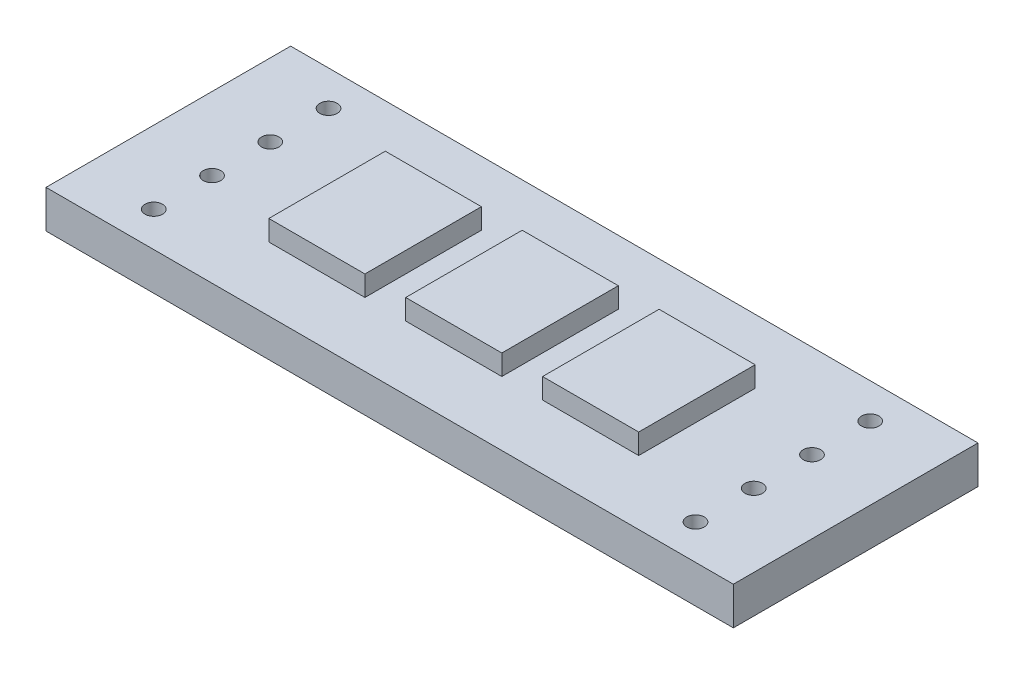
ISO-10303-21;
HEADER;
FILE_DESCRIPTION(('STEP AP214'),'2;1');
FILE_NAME('part.step','',(''),(''),'','','');
FILE_SCHEMA(('AUTOMOTIVE_DESIGN { 1 0 10303 214 1 1 1 1 }'));
ENDSEC;
DATA;
#1=APPLICATION_CONTEXT('core data for automotive mechanical design processes');
#2=APPLICATION_PROTOCOL_DEFINITION('international standard','automotive_design',2000,#1);
#3=PRODUCT_CONTEXT('',#1,'mechanical');
#4=PRODUCT('Part','Part','',(#3));
#5=PRODUCT_RELATED_PRODUCT_CATEGORY('part','',(#4));
#6=PRODUCT_DEFINITION_FORMATION('','',#4);
#7=PRODUCT_DEFINITION_CONTEXT('part definition',#1,'design');
#8=PRODUCT_DEFINITION('design','',#6,#7);
#9=PRODUCT_DEFINITION_SHAPE('','',#8);
#10=(LENGTH_UNIT() NAMED_UNIT(*) SI_UNIT(.MILLI.,.METRE.));
#11=(NAMED_UNIT(*) PLANE_ANGLE_UNIT() SI_UNIT($,.RADIAN.));
#12=(NAMED_UNIT(*) SI_UNIT($,.STERADIAN.) SOLID_ANGLE_UNIT());
#13=UNCERTAINTY_MEASURE_WITH_UNIT(LENGTH_MEASURE(1.E-05),#10,'distance_accuracy_value','');
#14=(GEOMETRIC_REPRESENTATION_CONTEXT(3) GLOBAL_UNCERTAINTY_ASSIGNED_CONTEXT((#13)) GLOBAL_UNIT_ASSIGNED_CONTEXT((#10,
#11,#12)) REPRESENTATION_CONTEXT('',''));
#15=CARTESIAN_POINT('',(0.,0.,0.));
#16=DIRECTION('',(0.,0.,1.));
#17=DIRECTION('',(1.,0.,0.));
#18=AXIS2_PLACEMENT_3D('',#15,#16,#17);
#19=CARTESIAN_POINT('',(0.,1.651,0.));
#20=DIRECTION('',(0.,-1.,0.));
#21=DIRECTION('',(0.,0.,-1.));
#22=AXIS2_PLACEMENT_3D('',#19,#20,#21);
#23=PLANE('',#22);
#24=CARTESIAN_POINT('',(3.175,1.651,-9.144));
#25=DIRECTION('',(0.,1.,0.));
#26=DIRECTION('',(0.,0.,1.));
#27=AXIS2_PLACEMENT_3D('',#24,#25,#26);
#28=CIRCLE('',#27,0.380999999999998);
#29=CARTESIAN_POINT('',(3.175,1.651,-8.763));
#30=VERTEX_POINT('',#29);
#31=EDGE_CURVE('E569',#30,#30,#28,.T.);
#32=ORIENTED_EDGE('',*,*,#31,.F.);
#33=EDGE_LOOP('',(#32));
#34=FACE_BOUND('',#33,.T.);
#35=CARTESIAN_POINT('',(3.175,1.651,-6.604));
#36=DIRECTION('',(0.,1.,0.));
#37=DIRECTION('',(0.,0.,1.));
#38=AXIS2_PLACEMENT_3D('',#35,#36,#37);
#39=CIRCLE('',#38,0.380999999999998);
#40=CARTESIAN_POINT('',(3.175,1.651,-6.223));
#41=VERTEX_POINT('',#40);
#42=EDGE_CURVE('E571',#41,#41,#39,.T.);
#43=ORIENTED_EDGE('',*,*,#42,.F.);
#44=EDGE_LOOP('',(#43));
#45=FACE_BOUND('',#44,.T.);
#46=CARTESIAN_POINT('',(3.175,1.651,-4.064));
#47=DIRECTION('',(0.,1.,0.));
#48=DIRECTION('',(0.,0.,-1.));
#49=AXIS2_PLACEMENT_3D('',#46,#47,#48);
#50=CIRCLE('',#49,0.380999999999998);
#51=CARTESIAN_POINT('',(3.175,1.651,-4.445));
#52=VERTEX_POINT('',#51);
#53=EDGE_CURVE('E577',#52,#52,#50,.T.);
#54=ORIENTED_EDGE('',*,*,#53,.F.);
#55=EDGE_LOOP('',(#54));
#56=FACE_BOUND('',#55,.T.);
#57=CARTESIAN_POINT('',(3.175,1.651,-1.524));
#58=DIRECTION('',(0.,1.,0.));
#59=DIRECTION('',(0.,0.,-1.));
#60=AXIS2_PLACEMENT_3D('',#57,#58,#59);
#61=CIRCLE('',#60,0.380999999999998);
#62=CARTESIAN_POINT('',(3.175,1.651,-1.905));
#63=VERTEX_POINT('',#62);
#64=EDGE_CURVE('E583',#63,#63,#61,.T.);
#65=ORIENTED_EDGE('',*,*,#64,.F.);
#66=EDGE_LOOP('',(#65));
#67=FACE_BOUND('',#66,.T.);
#68=CARTESIAN_POINT('',(26.797,1.651,-9.144));
#69=DIRECTION('',(0.,1.,0.));
#70=DIRECTION('',(0.,0.,-1.));
#71=AXIS2_PLACEMENT_3D('',#68,#69,#70);
#72=CIRCLE('',#71,0.380999999999998);
#73=CARTESIAN_POINT('',(26.797,1.651,-9.525));
#74=VERTEX_POINT('',#73);
#75=EDGE_CURVE('E589',#74,#74,#72,.T.);
#76=ORIENTED_EDGE('',*,*,#75,.F.);
#77=EDGE_LOOP('',(#76));
#78=FACE_BOUND('',#77,.T.);
#79=CARTESIAN_POINT('',(26.797,1.651,-6.604));
#80=DIRECTION('',(0.,1.,0.));
#81=DIRECTION('',(0.,0.,-1.));
#82=AXIS2_PLACEMENT_3D('',#79,#80,#81);
#83=CIRCLE('',#82,0.380999999999998);
#84=CARTESIAN_POINT('',(26.797,1.651,-6.985));
#85=VERTEX_POINT('',#84);
#86=EDGE_CURVE('E595',#85,#85,#83,.T.);
#87=ORIENTED_EDGE('',*,*,#86,.F.);
#88=EDGE_LOOP('',(#87));
#89=FACE_BOUND('',#88,.T.);
#90=CARTESIAN_POINT('',(26.797,1.651,-4.064));
#91=DIRECTION('',(0.,1.,0.));
#92=DIRECTION('',(0.,0.,1.));
#93=AXIS2_PLACEMENT_3D('',#90,#91,#92);
#94=CIRCLE('',#93,0.380999999999998);
#95=CARTESIAN_POINT('',(26.797,1.651,-3.683));
#96=VERTEX_POINT('',#95);
#97=EDGE_CURVE('E601',#96,#96,#94,.T.);
#98=ORIENTED_EDGE('',*,*,#97,.F.);
#99=EDGE_LOOP('',(#98));
#100=FACE_BOUND('',#99,.T.);
#101=CARTESIAN_POINT('',(26.797,1.651,-1.524));
#102=DIRECTION('',(0.,1.,0.));
#103=DIRECTION('',(0.,0.,1.));
#104=AXIS2_PLACEMENT_3D('',#101,#102,#103);
#105=CIRCLE('',#104,0.380999999999998);
#106=CARTESIAN_POINT('',(26.797,1.651,-1.143));
#107=VERTEX_POINT('',#106);
#108=EDGE_CURVE('E607',#107,#107,#105,.T.);
#109=ORIENTED_EDGE('',*,*,#108,.F.);
#110=EDGE_LOOP('',(#109));
#111=FACE_BOUND('',#110,.T.);
#112=DIRECTION('',(-1.,0.,0.));
#113=VECTOR('',#112,1.);
#114=CARTESIAN_POINT('',(18.8595,1.651,-7.874));
#115=LINE('',#114,#113);
#116=CARTESIAN_POINT('',(23.0505,1.651,-7.874));
#117=VERTEX_POINT('',#116);
#118=CARTESIAN_POINT('',(18.8595,1.651,-7.874));
#119=VERTEX_POINT('',#118);
#120=EDGE_CURVE('E170',#117,#119,#115,.T.);
#121=ORIENTED_EDGE('',*,*,#120,.F.);
#122=DIRECTION('',(0.,0.,-1.));
#123=VECTOR('',#122,1.);
#124=CARTESIAN_POINT('',(23.0505,1.651,-7.874));
#125=LINE('',#124,#123);
#126=CARTESIAN_POINT('',(23.0505,1.651,-2.794));
#127=VERTEX_POINT('',#126);
#128=EDGE_CURVE('E183',#127,#117,#125,.T.);
#129=ORIENTED_EDGE('',*,*,#128,.F.);
#130=DIRECTION('',(1.,0.,0.));
#131=VECTOR('',#130,1.);
#132=CARTESIAN_POINT('',(18.8595,1.651,-2.794));
#133=LINE('',#132,#131);
#134=CARTESIAN_POINT('',(18.8595,1.651,-2.794));
#135=VERTEX_POINT('',#134);
#136=EDGE_CURVE('E192',#135,#127,#133,.T.);
#137=ORIENTED_EDGE('',*,*,#136,.F.);
#138=DIRECTION('',(0.,0.,1.));
#139=VECTOR('',#138,1.);
#140=CARTESIAN_POINT('',(18.8595,1.651,-7.874));
#141=LINE('',#140,#139);
#142=EDGE_CURVE('E173',#119,#135,#141,.T.);
#143=ORIENTED_EDGE('',*,*,#142,.F.);
#144=EDGE_LOOP('',(#121,#129,#137,#143));
#145=FACE_BOUND('',#144,.T.);
#146=DIRECTION('',(0.,0.,1.));
#147=VECTOR('',#146,1.);
#148=CARTESIAN_POINT('',(0.,1.651,0.));
#149=LINE('',#148,#147);
#150=CARTESIAN_POINT('',(0.,1.651,-10.668));
#151=VERTEX_POINT('',#150);
#152=CARTESIAN_POINT('',(0.,1.651,0.));
#153=VERTEX_POINT('',#152);
#154=EDGE_CURVE('E242',#151,#153,#149,.T.);
#155=ORIENTED_EDGE('',*,*,#154,.T.);
#156=DIRECTION('',(1.,0.,0.));
#157=VECTOR('',#156,1.);
#158=CARTESIAN_POINT('',(0.,1.651,0.));
#159=LINE('',#158,#157);
#160=CARTESIAN_POINT('',(29.972,1.651,0.));
#161=VERTEX_POINT('',#160);
#162=EDGE_CURVE('E245',#153,#161,#159,.T.);
#163=ORIENTED_EDGE('',*,*,#162,.T.);
#164=DIRECTION('',(0.,0.,-1.));
#165=VECTOR('',#164,1.);
#166=CARTESIAN_POINT('',(29.972,1.651,0.));
#167=LINE('',#166,#165);
#168=CARTESIAN_POINT('',(29.972,1.651,-10.668));
#169=VERTEX_POINT('',#168);
#170=EDGE_CURVE('E248',#161,#169,#167,.T.);
#171=ORIENTED_EDGE('',*,*,#170,.T.);
#172=DIRECTION('',(-1.,0.,0.));
#173=VECTOR('',#172,1.);
#174=CARTESIAN_POINT('',(0.,1.651,-10.668));
#175=LINE('',#174,#173);
#176=EDGE_CURVE('E250',#169,#151,#175,.T.);
#177=ORIENTED_EDGE('',*,*,#176,.T.);
#178=EDGE_LOOP('',(#155,#163,#171,#177));
#179=FACE_BOUND('',#178,.T.);
#180=DIRECTION('',(0.,0.,-1.));
#181=VECTOR('',#180,1.);
#182=CARTESIAN_POINT('',(17.0815,1.651,-7.874));
#183=LINE('',#182,#181);
#184=CARTESIAN_POINT('',(17.0815,1.651,-2.794));
#185=VERTEX_POINT('',#184);
#186=CARTESIAN_POINT('',(17.0815,1.651,-7.874));
#187=VERTEX_POINT('',#186);
#188=EDGE_CURVE('E208',#185,#187,#183,.T.);
#189=ORIENTED_EDGE('',*,*,#188,.F.);
#190=DIRECTION('',(1.,0.,0.));
#191=VECTOR('',#190,1.);
#192=CARTESIAN_POINT('',(12.8905,1.651,-2.794));
#193=LINE('',#192,#191);
#194=CARTESIAN_POINT('',(12.8905,1.651,-2.794));
#195=VERTEX_POINT('',#194);
#196=EDGE_CURVE('E213',#195,#185,#193,.T.);
#197=ORIENTED_EDGE('',*,*,#196,.F.);
#198=DIRECTION('',(0.,0.,1.));
#199=VECTOR('',#198,1.);
#200=CARTESIAN_POINT('',(12.8905,1.651,-7.874));
#201=LINE('',#200,#199);
#202=CARTESIAN_POINT('',(12.8905,1.651,-7.874));
#203=VERTEX_POINT('',#202);
#204=EDGE_CURVE('E225',#203,#195,#201,.T.);
#205=ORIENTED_EDGE('',*,*,#204,.F.);
#206=DIRECTION('',(-1.,0.,0.));
#207=VECTOR('',#206,1.);
#208=CARTESIAN_POINT('',(17.0815,1.651,-7.874));
#209=LINE('',#208,#207);
#210=EDGE_CURVE('E222',#187,#203,#209,.T.);
#211=ORIENTED_EDGE('',*,*,#210,.F.);
#212=EDGE_LOOP('',(#189,#197,#205,#211));
#213=FACE_BOUND('',#212,.T.);
#214=DIRECTION('',(0.,0.,-1.));
#215=VECTOR('',#214,1.);
#216=CARTESIAN_POINT('',(11.1125,1.651,-7.874));
#217=LINE('',#216,#215);
#218=CARTESIAN_POINT('',(11.1125,1.651,-2.794));
#219=VERTEX_POINT('',#218);
#220=CARTESIAN_POINT('',(11.1125,1.651,-7.874));
#221=VERTEX_POINT('',#220);
#222=EDGE_CURVE('E169',#219,#221,#217,.T.);
#223=ORIENTED_EDGE('',*,*,#222,.F.);
#224=DIRECTION('',(1.,0.,0.));
#225=VECTOR('',#224,1.);
#226=CARTESIAN_POINT('',(11.1125,1.651,-2.794));
#227=LINE('',#226,#225);
#228=CARTESIAN_POINT('',(6.9215,1.651,-2.794));
#229=VERTEX_POINT('',#228);
#230=EDGE_CURVE('E166',#229,#219,#227,.T.);
#231=ORIENTED_EDGE('',*,*,#230,.F.);
#232=DIRECTION('',(0.,0.,1.));
#233=VECTOR('',#232,1.);
#234=CARTESIAN_POINT('',(6.9215,1.651,-7.874));
#235=LINE('',#234,#233);
#236=CARTESIAN_POINT('',(6.9215,1.651,-7.874));
#237=VERTEX_POINT('',#236);
#238=EDGE_CURVE('E56',#237,#229,#235,.T.);
#239=ORIENTED_EDGE('',*,*,#238,.F.);
#240=DIRECTION('',(-1.,0.,0.));
#241=VECTOR('',#240,1.);
#242=CARTESIAN_POINT('',(11.1125,1.651,-7.874));
#243=LINE('',#242,#241);
#244=EDGE_CURVE('E51',#221,#237,#243,.T.);
#245=ORIENTED_EDGE('',*,*,#244,.F.);
#246=EDGE_LOOP('',(#223,#231,#239,#245));
#247=FACE_BOUND('',#246,.T.);
#248=ADVANCED_FACE('F36',(#34,#45,#56,#67,#78,#89,#100,#111,#145,#179,#213,#247),#23,.F.);
#249=CARTESIAN_POINT('',(0.,1.651,0.));
#250=DIRECTION('',(1.,0.,0.));
#251=DIRECTION('',(0.,0.,-1.));
#252=AXIS2_PLACEMENT_3D('',#249,#250,#251);
#253=PLANE('',#252);
#254=DIRECTION('',(0.,0.,1.));
#255=VECTOR('',#254,1.);
#256=CARTESIAN_POINT('',(0.,0.,0.));
#257=LINE('',#256,#255);
#258=CARTESIAN_POINT('',(0.,0.,-10.668));
#259=VERTEX_POINT('',#258);
#260=CARTESIAN_POINT('',(0.,0.,0.));
#261=VERTEX_POINT('',#260);
#262=EDGE_CURVE('E241',#259,#261,#257,.T.);
#263=ORIENTED_EDGE('',*,*,#262,.T.);
#264=DIRECTION('',(0.,-1.,0.));
#265=VECTOR('',#264,1.);
#266=CARTESIAN_POINT('',(0.,1.651,0.));
#267=LINE('',#266,#265);
#268=EDGE_CURVE('E11',#153,#261,#267,.T.);
#269=ORIENTED_EDGE('',*,*,#268,.F.);
#270=ORIENTED_EDGE('',*,*,#154,.F.);
#271=DIRECTION('',(0.,-1.,0.));
#272=VECTOR('',#271,1.);
#273=CARTESIAN_POINT('',(0.,1.651,-10.668));
#274=LINE('',#273,#272);
#275=EDGE_CURVE('E252',#151,#259,#274,.T.);
#276=ORIENTED_EDGE('',*,*,#275,.T.);
#277=EDGE_LOOP('',(#263,#269,#270,#276));
#278=FACE_BOUND('',#277,.T.);
#279=ADVANCED_FACE('F38',(#278),#253,.F.);
#280=CARTESIAN_POINT('',(0.,1.651,0.));
#281=DIRECTION('',(0.,0.,-1.));
#282=DIRECTION('',(-1.,0.,0.));
#283=AXIS2_PLACEMENT_3D('',#280,#281,#282);
#284=PLANE('',#283);
#285=DIRECTION('',(1.,0.,0.));
#286=VECTOR('',#285,1.);
#287=CARTESIAN_POINT('',(0.,0.,0.));
#288=LINE('',#287,#286);
#289=CARTESIAN_POINT('',(29.972,0.,0.));
#290=VERTEX_POINT('',#289);
#291=EDGE_CURVE('E255',#261,#290,#288,.T.);
#292=ORIENTED_EDGE('',*,*,#291,.T.);
#293=DIRECTION('',(0.,-1.,0.));
#294=VECTOR('',#293,1.);
#295=CARTESIAN_POINT('',(29.972,1.651,0.));
#296=LINE('',#295,#294);
#297=EDGE_CURVE('E44',#161,#290,#296,.T.);
#298=ORIENTED_EDGE('',*,*,#297,.F.);
#299=ORIENTED_EDGE('',*,*,#162,.F.);
#300=ORIENTED_EDGE('',*,*,#268,.T.);
#301=EDGE_LOOP('',(#292,#298,#299,#300));
#302=FACE_BOUND('',#301,.T.);
#303=ADVANCED_FACE('F285',(#302),#284,.F.);
#304=CARTESIAN_POINT('',(29.972,1.651,0.));
#305=DIRECTION('',(-1.,0.,0.));
#306=DIRECTION('',(0.,0.,1.));
#307=AXIS2_PLACEMENT_3D('',#304,#305,#306);
#308=PLANE('',#307);
#309=DIRECTION('',(0.,0.,-1.));
#310=VECTOR('',#309,1.);
#311=CARTESIAN_POINT('',(29.972,0.,0.));
#312=LINE('',#311,#310);
#313=CARTESIAN_POINT('',(29.972,0.,-10.668));
#314=VERTEX_POINT('',#313);
#315=EDGE_CURVE('E257',#290,#314,#312,.T.);
#316=ORIENTED_EDGE('',*,*,#315,.T.);
#317=DIRECTION('',(0.,-1.,0.));
#318=VECTOR('',#317,1.);
#319=CARTESIAN_POINT('',(29.972,1.651,-10.668));
#320=LINE('',#319,#318);
#321=EDGE_CURVE('E262',#169,#314,#320,.T.);
#322=ORIENTED_EDGE('',*,*,#321,.F.);
#323=ORIENTED_EDGE('',*,*,#170,.F.);
#324=ORIENTED_EDGE('',*,*,#297,.T.);
#325=EDGE_LOOP('',(#316,#322,#323,#324));
#326=FACE_BOUND('',#325,.T.);
#327=ADVANCED_FACE('F269',(#326),#308,.F.);
#328=CARTESIAN_POINT('',(0.,1.651,-10.668));
#329=DIRECTION('',(0.,0.,1.));
#330=DIRECTION('',(1.,0.,0.));
#331=AXIS2_PLACEMENT_3D('',#328,#329,#330);
#332=PLANE('',#331);
#333=DIRECTION('',(-1.,0.,0.));
#334=VECTOR('',#333,1.);
#335=CARTESIAN_POINT('',(0.,0.,-10.668));
#336=LINE('',#335,#334);
#337=EDGE_CURVE('E246',#314,#259,#336,.T.);
#338=ORIENTED_EDGE('',*,*,#337,.T.);
#339=ORIENTED_EDGE('',*,*,#275,.F.);
#340=ORIENTED_EDGE('',*,*,#176,.F.);
#341=ORIENTED_EDGE('',*,*,#321,.T.);
#342=EDGE_LOOP('',(#338,#339,#340,#341));
#343=FACE_BOUND('',#342,.T.);
#344=ADVANCED_FACE('F278',(#343),#332,.F.);
#345=CARTESIAN_POINT('',(0.,0.,0.));
#346=DIRECTION('',(0.,-1.,0.));
#347=DIRECTION('',(0.,0.,-1.));
#348=AXIS2_PLACEMENT_3D('',#345,#346,#347);
#349=PLANE('',#348);
#350=CARTESIAN_POINT('',(3.175,0.,-9.144));
#351=DIRECTION('',(0.,1.,0.));
#352=DIRECTION('',(0.,0.,1.));
#353=AXIS2_PLACEMENT_3D('',#350,#351,#352);
#354=CIRCLE('',#353,0.380999999999998);
#355=CARTESIAN_POINT('',(3.175,0.,-8.763));
#356=VERTEX_POINT('',#355);
#357=EDGE_CURVE('E567',#356,#356,#354,.T.);
#358=ORIENTED_EDGE('',*,*,#357,.T.);
#359=EDGE_LOOP('',(#358));
#360=FACE_BOUND('',#359,.T.);
#361=CARTESIAN_POINT('',(3.175,0.,-6.604));
#362=DIRECTION('',(0.,1.,0.));
#363=DIRECTION('',(0.,0.,1.));
#364=AXIS2_PLACEMENT_3D('',#361,#362,#363);
#365=CIRCLE('',#364,0.380999999999998);
#366=CARTESIAN_POINT('',(3.175,0.,-6.223));
#367=VERTEX_POINT('',#366);
#368=EDGE_CURVE('E574',#367,#367,#365,.T.);
#369=ORIENTED_EDGE('',*,*,#368,.T.);
#370=EDGE_LOOP('',(#369));
#371=FACE_BOUND('',#370,.T.);
#372=CARTESIAN_POINT('',(3.175,0.,-4.064));
#373=DIRECTION('',(0.,1.,0.));
#374=DIRECTION('',(0.,0.,-1.));
#375=AXIS2_PLACEMENT_3D('',#372,#373,#374);
#376=CIRCLE('',#375,0.380999999999998);
#377=CARTESIAN_POINT('',(3.175,0.,-4.445));
#378=VERTEX_POINT('',#377);
#379=EDGE_CURVE('E580',#378,#378,#376,.T.);
#380=ORIENTED_EDGE('',*,*,#379,.T.);
#381=EDGE_LOOP('',(#380));
#382=FACE_BOUND('',#381,.T.);
#383=CARTESIAN_POINT('',(3.175,0.,-1.524));
#384=DIRECTION('',(0.,1.,0.));
#385=DIRECTION('',(0.,0.,-1.));
#386=AXIS2_PLACEMENT_3D('',#383,#384,#385);
#387=CIRCLE('',#386,0.380999999999998);
#388=CARTESIAN_POINT('',(3.175,0.,-1.905));
#389=VERTEX_POINT('',#388);
#390=EDGE_CURVE('E586',#389,#389,#387,.T.);
#391=ORIENTED_EDGE('',*,*,#390,.T.);
#392=EDGE_LOOP('',(#391));
#393=FACE_BOUND('',#392,.T.);
#394=CARTESIAN_POINT('',(26.797,0.,-9.144));
#395=DIRECTION('',(0.,1.,0.));
#396=DIRECTION('',(0.,0.,-1.));
#397=AXIS2_PLACEMENT_3D('',#394,#395,#396);
#398=CIRCLE('',#397,0.380999999999998);
#399=CARTESIAN_POINT('',(26.797,0.,-9.525));
#400=VERTEX_POINT('',#399);
#401=EDGE_CURVE('E592',#400,#400,#398,.T.);
#402=ORIENTED_EDGE('',*,*,#401,.T.);
#403=EDGE_LOOP('',(#402));
#404=FACE_BOUND('',#403,.T.);
#405=CARTESIAN_POINT('',(26.797,0.,-6.604));
#406=DIRECTION('',(0.,1.,0.));
#407=DIRECTION('',(0.,0.,-1.));
#408=AXIS2_PLACEMENT_3D('',#405,#406,#407);
#409=CIRCLE('',#408,0.380999999999998);
#410=CARTESIAN_POINT('',(26.797,0.,-6.985));
#411=VERTEX_POINT('',#410);
#412=EDGE_CURVE('E598',#411,#411,#409,.T.);
#413=ORIENTED_EDGE('',*,*,#412,.T.);
#414=EDGE_LOOP('',(#413));
#415=FACE_BOUND('',#414,.T.);
#416=CARTESIAN_POINT('',(26.797,0.,-4.064));
#417=DIRECTION('',(0.,1.,0.));
#418=DIRECTION('',(0.,0.,1.));
#419=AXIS2_PLACEMENT_3D('',#416,#417,#418);
#420=CIRCLE('',#419,0.380999999999998);
#421=CARTESIAN_POINT('',(26.797,0.,-3.683));
#422=VERTEX_POINT('',#421);
#423=EDGE_CURVE('E604',#422,#422,#420,.T.);
#424=ORIENTED_EDGE('',*,*,#423,.T.);
#425=EDGE_LOOP('',(#424));
#426=FACE_BOUND('',#425,.T.);
#427=CARTESIAN_POINT('',(26.797,0.,-1.524));
#428=DIRECTION('',(0.,1.,0.));
#429=DIRECTION('',(0.,0.,1.));
#430=AXIS2_PLACEMENT_3D('',#427,#428,#429);
#431=CIRCLE('',#430,0.380999999999998);
#432=CARTESIAN_POINT('',(26.797,0.,-1.143));
#433=VERTEX_POINT('',#432);
#434=EDGE_CURVE('E610',#433,#433,#431,.T.);
#435=ORIENTED_EDGE('',*,*,#434,.T.);
#436=EDGE_LOOP('',(#435));
#437=FACE_BOUND('',#436,.T.);
#438=ORIENTED_EDGE('',*,*,#262,.F.);
#439=ORIENTED_EDGE('',*,*,#337,.F.);
#440=ORIENTED_EDGE('',*,*,#315,.F.);
#441=ORIENTED_EDGE('',*,*,#291,.F.);
#442=EDGE_LOOP('',(#438,#439,#440,#441));
#443=FACE_BOUND('',#442,.T.);
#444=ADVANCED_FACE('F275',(#360,#371,#382,#393,#404,#415,#426,#437,#443),#349,.T.);
#445=CARTESIAN_POINT('',(17.0815,2.54,-7.874));
#446=DIRECTION('',(-1.,0.,0.));
#447=DIRECTION('',(0.,0.,1.));
#448=AXIS2_PLACEMENT_3D('',#445,#446,#447);
#449=PLANE('',#448);
#450=ORIENTED_EDGE('',*,*,#188,.T.);
#451=DIRECTION('',(0.,-1.,0.));
#452=VECTOR('',#451,1.);
#453=CARTESIAN_POINT('',(17.0815,2.54,-7.874));
#454=LINE('',#453,#452);
#455=CARTESIAN_POINT('',(17.0815,2.54,-7.874));
#456=VERTEX_POINT('',#455);
#457=EDGE_CURVE('E238',#456,#187,#454,.T.);
#458=ORIENTED_EDGE('',*,*,#457,.F.);
#459=DIRECTION('',(0.,0.,-1.));
#460=VECTOR('',#459,1.);
#461=CARTESIAN_POINT('',(17.0815,2.54,-7.874));
#462=LINE('',#461,#460);
#463=CARTESIAN_POINT('',(17.0815,2.54,-2.794));
#464=VERTEX_POINT('',#463);
#465=EDGE_CURVE('E209',#464,#456,#462,.T.);
#466=ORIENTED_EDGE('',*,*,#465,.F.);
#467=DIRECTION('',(0.,-1.,0.));
#468=VECTOR('',#467,1.);
#469=CARTESIAN_POINT('',(17.0815,2.54,-2.794));
#470=LINE('',#469,#468);
#471=EDGE_CURVE('E219',#464,#185,#470,.T.);
#472=ORIENTED_EDGE('',*,*,#471,.T.);
#473=EDGE_LOOP('',(#450,#458,#466,#472));
#474=FACE_BOUND('',#473,.T.);
#475=ADVANCED_FACE('F301',(#474),#449,.F.);
#476=CARTESIAN_POINT('',(17.0815,2.54,-7.874));
#477=DIRECTION('',(0.,0.,1.));
#478=DIRECTION('',(1.,0.,0.));
#479=AXIS2_PLACEMENT_3D('',#476,#477,#478);
#480=PLANE('',#479);
#481=ORIENTED_EDGE('',*,*,#210,.T.);
#482=DIRECTION('',(0.,-1.,0.));
#483=VECTOR('',#482,1.);
#484=CARTESIAN_POINT('',(12.8905,2.54,-7.874));
#485=LINE('',#484,#483);
#486=CARTESIAN_POINT('',(12.8905,2.54,-7.874));
#487=VERTEX_POINT('',#486);
#488=EDGE_CURVE('E235',#487,#203,#485,.T.);
#489=ORIENTED_EDGE('',*,*,#488,.F.);
#490=DIRECTION('',(-1.,0.,0.));
#491=VECTOR('',#490,1.);
#492=CARTESIAN_POINT('',(17.0815,2.54,-7.874));
#493=LINE('',#492,#491);
#494=EDGE_CURVE('E212',#456,#487,#493,.T.);
#495=ORIENTED_EDGE('',*,*,#494,.F.);
#496=ORIENTED_EDGE('',*,*,#457,.T.);
#497=EDGE_LOOP('',(#481,#489,#495,#496));
#498=FACE_BOUND('',#497,.T.);
#499=ADVANCED_FACE('F323',(#498),#480,.F.);
#500=CARTESIAN_POINT('',(12.8905,2.54,-7.874));
#501=DIRECTION('',(1.,0.,0.));
#502=DIRECTION('',(0.,0.,-1.));
#503=AXIS2_PLACEMENT_3D('',#500,#501,#502);
#504=PLANE('',#503);
#505=ORIENTED_EDGE('',*,*,#204,.T.);
#506=DIRECTION('',(0.,-1.,0.));
#507=VECTOR('',#506,1.);
#508=CARTESIAN_POINT('',(12.8905,2.54,-2.794));
#509=LINE('',#508,#507);
#510=CARTESIAN_POINT('',(12.8905,2.54,-2.794));
#511=VERTEX_POINT('',#510);
#512=EDGE_CURVE('E232',#511,#195,#509,.T.);
#513=ORIENTED_EDGE('',*,*,#512,.F.);
#514=DIRECTION('',(0.,0.,1.));
#515=VECTOR('',#514,1.);
#516=CARTESIAN_POINT('',(12.8905,2.54,-7.874));
#517=LINE('',#516,#515);
#518=EDGE_CURVE('E215',#487,#511,#517,.T.);
#519=ORIENTED_EDGE('',*,*,#518,.F.);
#520=ORIENTED_EDGE('',*,*,#488,.T.);
#521=EDGE_LOOP('',(#505,#513,#519,#520));
#522=FACE_BOUND('',#521,.T.);
#523=ADVANCED_FACE('F330',(#522),#504,.F.);
#524=CARTESIAN_POINT('',(12.8905,2.54,-2.794));
#525=DIRECTION('',(0.,0.,-1.));
#526=DIRECTION('',(-1.,0.,0.));
#527=AXIS2_PLACEMENT_3D('',#524,#525,#526);
#528=PLANE('',#527);
#529=ORIENTED_EDGE('',*,*,#196,.T.);
#530=ORIENTED_EDGE('',*,*,#471,.F.);
#531=DIRECTION('',(1.,0.,0.));
#532=VECTOR('',#531,1.);
#533=CARTESIAN_POINT('',(12.8905,2.54,-2.794));
#534=LINE('',#533,#532);
#535=EDGE_CURVE('E217',#511,#464,#534,.T.);
#536=ORIENTED_EDGE('',*,*,#535,.F.);
#537=ORIENTED_EDGE('',*,*,#512,.T.);
#538=EDGE_LOOP('',(#529,#530,#536,#537));
#539=FACE_BOUND('',#538,.T.);
#540=ADVANCED_FACE('F337',(#539),#528,.F.);
#541=CARTESIAN_POINT('',(0.,2.54,0.));
#542=DIRECTION('',(0.,1.,0.));
#543=DIRECTION('',(0.,0.,1.));
#544=AXIS2_PLACEMENT_3D('',#541,#542,#543);
#545=PLANE('',#544);
#546=ORIENTED_EDGE('',*,*,#465,.T.);
#547=ORIENTED_EDGE('',*,*,#494,.T.);
#548=ORIENTED_EDGE('',*,*,#518,.T.);
#549=ORIENTED_EDGE('',*,*,#535,.T.);
#550=EDGE_LOOP('',(#546,#547,#548,#549));
#551=FACE_BOUND('',#550,.T.);
#552=ADVANCED_FACE('F345',(#551),#545,.T.);
#553=CARTESIAN_POINT('',(18.8595,2.54,-7.874));
#554=DIRECTION('',(0.,0.,1.));
#555=DIRECTION('',(1.,0.,0.));
#556=AXIS2_PLACEMENT_3D('',#553,#554,#555);
#557=PLANE('',#556);
#558=ORIENTED_EDGE('',*,*,#120,.T.);
#559=DIRECTION('',(0.,-1.,0.));
#560=VECTOR('',#559,1.);
#561=CARTESIAN_POINT('',(18.8595,2.54,-7.874));
#562=LINE('',#561,#560);
#563=CARTESIAN_POINT('',(18.8595,2.54,-7.874));
#564=VERTEX_POINT('',#563);
#565=EDGE_CURVE('E205',#564,#119,#562,.T.);
#566=ORIENTED_EDGE('',*,*,#565,.F.);
#567=DIRECTION('',(-1.,0.,0.));
#568=VECTOR('',#567,1.);
#569=CARTESIAN_POINT('',(18.8595,2.54,-7.874));
#570=LINE('',#569,#568);
#571=CARTESIAN_POINT('',(23.0505,2.54,-7.874));
#572=VERTEX_POINT('',#571);
#573=EDGE_CURVE('E179',#572,#564,#570,.T.);
#574=ORIENTED_EDGE('',*,*,#573,.F.);
#575=DIRECTION('',(0.,-1.,0.));
#576=VECTOR('',#575,1.);
#577=CARTESIAN_POINT('',(23.0505,2.54,-7.874));
#578=LINE('',#577,#576);
#579=EDGE_CURVE('E188',#572,#117,#578,.T.);
#580=ORIENTED_EDGE('',*,*,#579,.T.);
#581=EDGE_LOOP('',(#558,#566,#574,#580));
#582=FACE_BOUND('',#581,.T.);
#583=ADVANCED_FACE('F353',(#582),#557,.F.);
#584=CARTESIAN_POINT('',(18.8595,2.54,-7.874));
#585=DIRECTION('',(1.,0.,0.));
#586=DIRECTION('',(0.,0.,-1.));
#587=AXIS2_PLACEMENT_3D('',#584,#585,#586);
#588=PLANE('',#587);
#589=ORIENTED_EDGE('',*,*,#142,.T.);
#590=DIRECTION('',(0.,-1.,0.));
#591=VECTOR('',#590,1.);
#592=CARTESIAN_POINT('',(18.8595,2.54,-2.794));
#593=LINE('',#592,#591);
#594=CARTESIAN_POINT('',(18.8595,2.54,-2.794));
#595=VERTEX_POINT('',#594);
#596=EDGE_CURVE('E202',#595,#135,#593,.T.);
#597=ORIENTED_EDGE('',*,*,#596,.F.);
#598=DIRECTION('',(0.,0.,1.));
#599=VECTOR('',#598,1.);
#600=CARTESIAN_POINT('',(18.8595,2.54,-7.874));
#601=LINE('',#600,#599);
#602=EDGE_CURVE('E182',#564,#595,#601,.T.);
#603=ORIENTED_EDGE('',*,*,#602,.F.);
#604=ORIENTED_EDGE('',*,*,#565,.T.);
#605=EDGE_LOOP('',(#589,#597,#603,#604));
#606=FACE_BOUND('',#605,.T.);
#607=ADVANCED_FACE('F361',(#606),#588,.F.);
#608=CARTESIAN_POINT('',(18.8595,2.54,-2.794));
#609=DIRECTION('',(0.,0.,-1.));
#610=DIRECTION('',(-1.,0.,0.));
#611=AXIS2_PLACEMENT_3D('',#608,#609,#610);
#612=PLANE('',#611);
#613=ORIENTED_EDGE('',*,*,#136,.T.);
#614=DIRECTION('',(0.,-1.,0.));
#615=VECTOR('',#614,1.);
#616=CARTESIAN_POINT('',(23.0505,2.54,-2.794));
#617=LINE('',#616,#615);
#618=CARTESIAN_POINT('',(23.0505,2.54,-2.794));
#619=VERTEX_POINT('',#618);
#620=EDGE_CURVE('E199',#619,#127,#617,.T.);
#621=ORIENTED_EDGE('',*,*,#620,.F.);
#622=DIRECTION('',(1.,0.,0.));
#623=VECTOR('',#622,1.);
#624=CARTESIAN_POINT('',(18.8595,2.54,-2.794));
#625=LINE('',#624,#623);
#626=EDGE_CURVE('E185',#595,#619,#625,.T.);
#627=ORIENTED_EDGE('',*,*,#626,.F.);
#628=ORIENTED_EDGE('',*,*,#596,.T.);
#629=EDGE_LOOP('',(#613,#621,#627,#628));
#630=FACE_BOUND('',#629,.T.);
#631=ADVANCED_FACE('F369',(#630),#612,.F.);
#632=CARTESIAN_POINT('',(23.0505,2.54,-7.874));
#633=DIRECTION('',(-1.,0.,0.));
#634=DIRECTION('',(0.,0.,1.));
#635=AXIS2_PLACEMENT_3D('',#632,#633,#634);
#636=PLANE('',#635);
#637=ORIENTED_EDGE('',*,*,#128,.T.);
#638=ORIENTED_EDGE('',*,*,#579,.F.);
#639=DIRECTION('',(0.,0.,-1.));
#640=VECTOR('',#639,1.);
#641=CARTESIAN_POINT('',(23.0505,2.54,-7.874));
#642=LINE('',#641,#640);
#643=EDGE_CURVE('E187',#619,#572,#642,.T.);
#644=ORIENTED_EDGE('',*,*,#643,.F.);
#645=ORIENTED_EDGE('',*,*,#620,.T.);
#646=EDGE_LOOP('',(#637,#638,#644,#645));
#647=FACE_BOUND('',#646,.T.);
#648=ADVANCED_FACE('F377',(#647),#636,.F.);
#649=CARTESIAN_POINT('',(0.,2.54,0.));
#650=DIRECTION('',(0.,-1.,0.));
#651=DIRECTION('',(0.,0.,-1.));
#652=AXIS2_PLACEMENT_3D('',#649,#650,#651);
#653=PLANE('',#652);
#654=ORIENTED_EDGE('',*,*,#573,.T.);
#655=ORIENTED_EDGE('',*,*,#602,.T.);
#656=ORIENTED_EDGE('',*,*,#626,.T.);
#657=ORIENTED_EDGE('',*,*,#643,.T.);
#658=EDGE_LOOP('',(#654,#655,#656,#657));
#659=FACE_BOUND('',#658,.T.);
#660=ADVANCED_FACE('F385',(#659),#653,.F.);
#661=CARTESIAN_POINT('',(11.1125,2.54,-7.874));
#662=DIRECTION('',(-1.,0.,0.));
#663=DIRECTION('',(0.,0.,1.));
#664=AXIS2_PLACEMENT_3D('',#661,#662,#663);
#665=PLANE('',#664);
#666=ORIENTED_EDGE('',*,*,#222,.T.);
#667=DIRECTION('',(0.,-1.,0.));
#668=VECTOR('',#667,1.);
#669=CARTESIAN_POINT('',(11.1125,2.54,-7.874));
#670=LINE('',#669,#668);
#671=CARTESIAN_POINT('',(11.1125,2.54,-7.874));
#672=VERTEX_POINT('',#671);
#673=EDGE_CURVE('E150',#672,#221,#670,.T.);
#674=ORIENTED_EDGE('',*,*,#673,.F.);
#675=DIRECTION('',(0.,0.,-1.));
#676=VECTOR('',#675,1.);
#677=CARTESIAN_POINT('',(11.1125,2.54,-7.874));
#678=LINE('',#677,#676);
#679=CARTESIAN_POINT('',(11.1125,2.54,-2.794));
#680=VERTEX_POINT('',#679);
#681=EDGE_CURVE('E157',#680,#672,#678,.T.);
#682=ORIENTED_EDGE('',*,*,#681,.F.);
#683=DIRECTION('',(0.,-1.,0.));
#684=VECTOR('',#683,1.);
#685=CARTESIAN_POINT('',(11.1125,2.54,-2.794));
#686=LINE('',#685,#684);
#687=EDGE_CURVE('E617',#680,#219,#686,.T.);
#688=ORIENTED_EDGE('',*,*,#687,.T.);
#689=EDGE_LOOP('',(#666,#674,#682,#688));
#690=FACE_BOUND('',#689,.T.);
#691=ADVANCED_FACE('F168',(#690),#665,.F.);
#692=CARTESIAN_POINT('',(11.1125,2.54,-7.874));
#693=DIRECTION('',(0.,0.,1.));
#694=DIRECTION('',(1.,0.,0.));
#695=AXIS2_PLACEMENT_3D('',#692,#693,#694);
#696=PLANE('',#695);
#697=ORIENTED_EDGE('',*,*,#244,.T.);
#698=DIRECTION('',(0.,-1.,0.));
#699=VECTOR('',#698,1.);
#700=CARTESIAN_POINT('',(6.9215,2.54,-7.874));
#701=LINE('',#700,#699);
#702=CARTESIAN_POINT('',(6.9215,2.54,-7.874));
#703=VERTEX_POINT('',#702);
#704=EDGE_CURVE('E153',#703,#237,#701,.T.);
#705=ORIENTED_EDGE('',*,*,#704,.F.);
#706=DIRECTION('',(-1.,0.,0.));
#707=VECTOR('',#706,1.);
#708=CARTESIAN_POINT('',(11.1125,2.54,-7.874));
#709=LINE('',#708,#707);
#710=EDGE_CURVE('E146',#672,#703,#709,.T.);
#711=ORIENTED_EDGE('',*,*,#710,.F.);
#712=ORIENTED_EDGE('',*,*,#673,.T.);
#713=EDGE_LOOP('',(#697,#705,#711,#712));
#714=FACE_BOUND('',#713,.T.);
#715=ADVANCED_FACE('F148',(#714),#696,.F.);
#716=CARTESIAN_POINT('',(6.9215,2.54,-7.874));
#717=DIRECTION('',(1.,0.,0.));
#718=DIRECTION('',(0.,0.,-1.));
#719=AXIS2_PLACEMENT_3D('',#716,#717,#718);
#720=PLANE('',#719);
#721=ORIENTED_EDGE('',*,*,#238,.T.);
#722=DIRECTION('',(0.,-1.,0.));
#723=VECTOR('',#722,1.);
#724=CARTESIAN_POINT('',(6.9215,2.54,-2.794));
#725=LINE('',#724,#723);
#726=CARTESIAN_POINT('',(6.9215,2.54,-2.794));
#727=VERTEX_POINT('',#726);
#728=EDGE_CURVE('E175',#727,#229,#725,.T.);
#729=ORIENTED_EDGE('',*,*,#728,.F.);
#730=DIRECTION('',(0.,0.,1.));
#731=VECTOR('',#730,1.);
#732=CARTESIAN_POINT('',(6.9215,2.54,-7.874));
#733=LINE('',#732,#731);
#734=EDGE_CURVE('E156',#703,#727,#733,.T.);
#735=ORIENTED_EDGE('',*,*,#734,.F.);
#736=ORIENTED_EDGE('',*,*,#704,.T.);
#737=EDGE_LOOP('',(#721,#729,#735,#736));
#738=FACE_BOUND('',#737,.T.);
#739=ADVANCED_FACE('F406',(#738),#720,.F.);
#740=CARTESIAN_POINT('',(11.1125,2.54,-2.794));
#741=DIRECTION('',(0.,0.,-1.));
#742=DIRECTION('',(-1.,0.,0.));
#743=AXIS2_PLACEMENT_3D('',#740,#741,#742);
#744=PLANE('',#743);
#745=ORIENTED_EDGE('',*,*,#230,.T.);
#746=ORIENTED_EDGE('',*,*,#687,.F.);
#747=DIRECTION('',(1.,0.,0.));
#748=VECTOR('',#747,1.);
#749=CARTESIAN_POINT('',(11.1125,2.54,-2.794));
#750=LINE('',#749,#748);
#751=EDGE_CURVE('E162',#727,#680,#750,.T.);
#752=ORIENTED_EDGE('',*,*,#751,.F.);
#753=ORIENTED_EDGE('',*,*,#728,.T.);
#754=EDGE_LOOP('',(#745,#746,#752,#753));
#755=FACE_BOUND('',#754,.T.);
#756=ADVANCED_FACE('F413',(#755),#744,.F.);
#757=CARTESIAN_POINT('',(0.,2.54,0.));
#758=DIRECTION('',(0.,-1.,0.));
#759=DIRECTION('',(0.,0.,-1.));
#760=AXIS2_PLACEMENT_3D('',#757,#758,#759);
#761=PLANE('',#760);
#762=ORIENTED_EDGE('',*,*,#681,.T.);
#763=ORIENTED_EDGE('',*,*,#710,.T.);
#764=ORIENTED_EDGE('',*,*,#734,.T.);
#765=ORIENTED_EDGE('',*,*,#751,.T.);
#766=EDGE_LOOP('',(#762,#763,#764,#765));
#767=FACE_BOUND('',#766,.T.);
#768=ADVANCED_FACE('F160',(#767),#761,.F.);
#769=CARTESIAN_POINT('',(26.797,0.,-1.524));
#770=DIRECTION('',(0.,1.,0.));
#771=DIRECTION('',(0.,0.,1.));
#772=AXIS2_PLACEMENT_3D('',#769,#770,#771);
#773=CYLINDRICAL_SURFACE('',#772,0.380999999999998);
#774=ORIENTED_EDGE('',*,*,#434,.F.);
#775=EDGE_LOOP('',(#774));
#776=FACE_BOUND('',#775,.T.);
#777=ORIENTED_EDGE('',*,*,#108,.T.);
#778=EDGE_LOOP('',(#777));
#779=FACE_BOUND('',#778,.T.);
#780=ADVANCED_FACE('F428',(#776,#779),#773,.F.);
#781=CARTESIAN_POINT('',(26.797,0.,-4.064));
#782=DIRECTION('',(0.,1.,0.));
#783=DIRECTION('',(0.,0.,1.));
#784=AXIS2_PLACEMENT_3D('',#781,#782,#783);
#785=CYLINDRICAL_SURFACE('',#784,0.380999999999998);
#786=ORIENTED_EDGE('',*,*,#423,.F.);
#787=EDGE_LOOP('',(#786));
#788=FACE_BOUND('',#787,.T.);
#789=ORIENTED_EDGE('',*,*,#97,.T.);
#790=EDGE_LOOP('',(#789));
#791=FACE_BOUND('',#790,.T.);
#792=ADVANCED_FACE('F434',(#788,#791),#785,.F.);
#793=CARTESIAN_POINT('',(26.797,0.,-6.604));
#794=DIRECTION('',(0.,1.,0.));
#795=DIRECTION('',(0.,0.,1.));
#796=AXIS2_PLACEMENT_3D('',#793,#794,#795);
#797=CYLINDRICAL_SURFACE('',#796,0.380999999999998);
#798=ORIENTED_EDGE('',*,*,#412,.F.);
#799=EDGE_LOOP('',(#798));
#800=FACE_BOUND('',#799,.T.);
#801=ORIENTED_EDGE('',*,*,#86,.T.);
#802=EDGE_LOOP('',(#801));
#803=FACE_BOUND('',#802,.T.);
#804=ADVANCED_FACE('F442',(#800,#803),#797,.F.);
#805=CARTESIAN_POINT('',(26.797,0.,-9.144));
#806=DIRECTION('',(0.,1.,0.));
#807=DIRECTION('',(0.,0.,1.));
#808=AXIS2_PLACEMENT_3D('',#805,#806,#807);
#809=CYLINDRICAL_SURFACE('',#808,0.380999999999998);
#810=ORIENTED_EDGE('',*,*,#401,.F.);
#811=EDGE_LOOP('',(#810));
#812=FACE_BOUND('',#811,.T.);
#813=ORIENTED_EDGE('',*,*,#75,.T.);
#814=EDGE_LOOP('',(#813));
#815=FACE_BOUND('',#814,.T.);
#816=ADVANCED_FACE('F450',(#812,#815),#809,.F.);
#817=CARTESIAN_POINT('',(3.175,0.,-1.524));
#818=DIRECTION('',(0.,1.,0.));
#819=DIRECTION('',(0.,0.,1.));
#820=AXIS2_PLACEMENT_3D('',#817,#818,#819);
#821=CYLINDRICAL_SURFACE('',#820,0.380999999999998);
#822=ORIENTED_EDGE('',*,*,#390,.F.);
#823=EDGE_LOOP('',(#822));
#824=FACE_BOUND('',#823,.T.);
#825=ORIENTED_EDGE('',*,*,#64,.T.);
#826=EDGE_LOOP('',(#825));
#827=FACE_BOUND('',#826,.T.);
#828=ADVANCED_FACE('F458',(#824,#827),#821,.F.);
#829=CARTESIAN_POINT('',(3.175,0.,-4.064));
#830=DIRECTION('',(0.,1.,0.));
#831=DIRECTION('',(0.,0.,1.));
#832=AXIS2_PLACEMENT_3D('',#829,#830,#831);
#833=CYLINDRICAL_SURFACE('',#832,0.380999999999998);
#834=ORIENTED_EDGE('',*,*,#379,.F.);
#835=EDGE_LOOP('',(#834));
#836=FACE_BOUND('',#835,.T.);
#837=ORIENTED_EDGE('',*,*,#53,.T.);
#838=EDGE_LOOP('',(#837));
#839=FACE_BOUND('',#838,.T.);
#840=ADVANCED_FACE('F466',(#836,#839),#833,.F.);
#841=CARTESIAN_POINT('',(3.175,0.,-6.604));
#842=DIRECTION('',(0.,1.,0.));
#843=DIRECTION('',(0.,0.,1.));
#844=AXIS2_PLACEMENT_3D('',#841,#842,#843);
#845=CYLINDRICAL_SURFACE('',#844,0.380999999999998);
#846=ORIENTED_EDGE('',*,*,#368,.F.);
#847=EDGE_LOOP('',(#846));
#848=FACE_BOUND('',#847,.T.);
#849=ORIENTED_EDGE('',*,*,#42,.T.);
#850=EDGE_LOOP('',(#849));
#851=FACE_BOUND('',#850,.T.);
#852=ADVANCED_FACE('F474',(#848,#851),#845,.F.);
#853=CARTESIAN_POINT('',(3.175,0.,-9.144));
#854=DIRECTION('',(0.,1.,0.));
#855=DIRECTION('',(0.,0.,1.));
#856=AXIS2_PLACEMENT_3D('',#853,#854,#855);
#857=CYLINDRICAL_SURFACE('',#856,0.380999999999998);
#858=ORIENTED_EDGE('',*,*,#357,.F.);
#859=EDGE_LOOP('',(#858));
#860=FACE_BOUND('',#859,.T.);
#861=ORIENTED_EDGE('',*,*,#31,.T.);
#862=EDGE_LOOP('',(#861));
#863=FACE_BOUND('',#862,.T.);
#864=ADVANCED_FACE('F482',(#860,#863),#857,.F.);
#865=CLOSED_SHELL('',(#248,#279,#303,#327,#344,#444,#475,#499,#523,#540,#552,#583,#607,#631,
#648,#660,#691,#715,#739,#756,#768,#780,#792,#804,#816,#828,#840,#852,#864));
#866=MANIFOLD_SOLID_BREP('B2',#865);
#867=ADVANCED_BREP_SHAPE_REPRESENTATION('',(#18,#866),#14);
#868=SHAPE_DEFINITION_REPRESENTATION(#9,#867);
ENDSEC;
END-ISO-10303-21;
